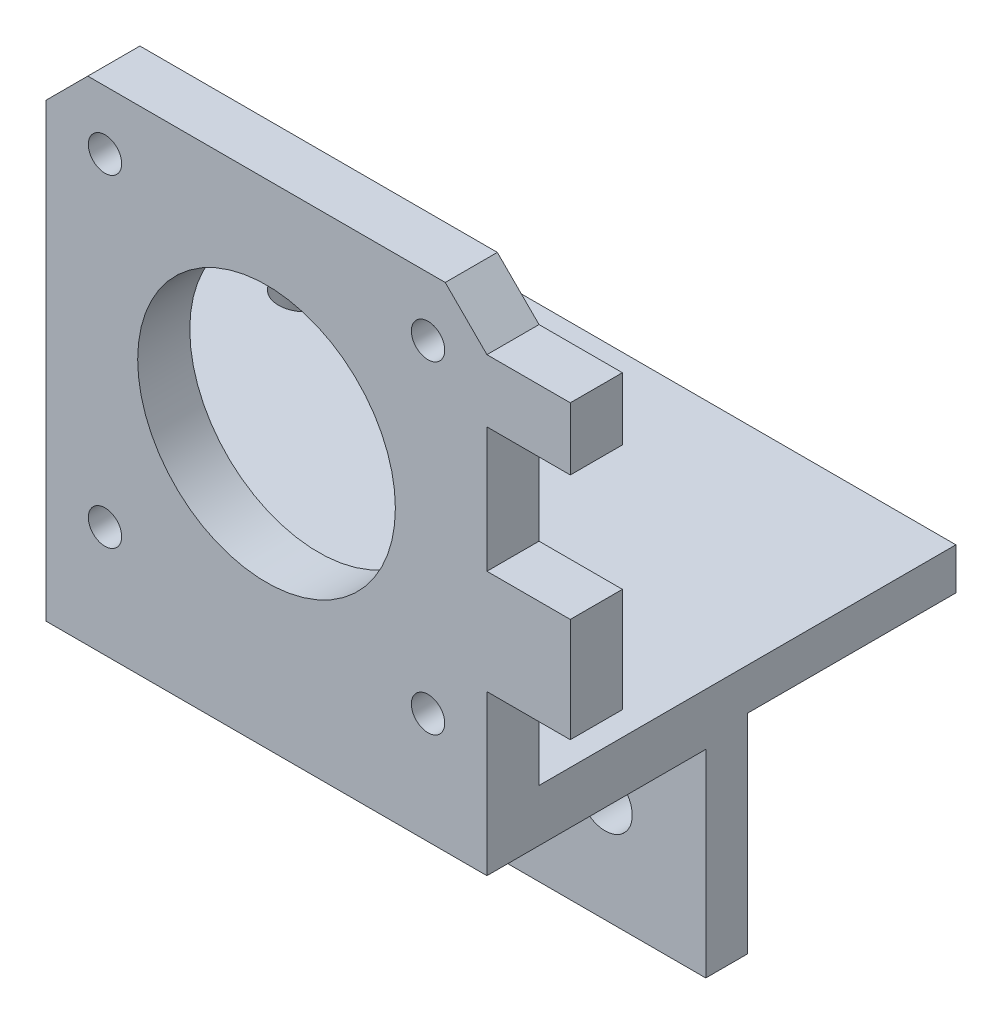
ISO-10303-21;
HEADER;
FILE_DESCRIPTION(('STEP AP214'),'2;1');
FILE_NAME('part.step','',(''),(''),'','','');
FILE_SCHEMA(('AUTOMOTIVE_DESIGN { 1 0 10303 214 1 1 1 1 }'));
ENDSEC;
DATA;
#1=APPLICATION_CONTEXT('core data for automotive mechanical design processes');
#2=APPLICATION_PROTOCOL_DEFINITION('international standard','automotive_design',2000,#1);
#3=PRODUCT_CONTEXT('',#1,'mechanical');
#4=PRODUCT('Part','Part','',(#3));
#5=PRODUCT_RELATED_PRODUCT_CATEGORY('part','',(#4));
#6=PRODUCT_DEFINITION_FORMATION('','',#4);
#7=PRODUCT_DEFINITION_CONTEXT('part definition',#1,'design');
#8=PRODUCT_DEFINITION('design','',#6,#7);
#9=PRODUCT_DEFINITION_SHAPE('','',#8);
#10=(LENGTH_UNIT() NAMED_UNIT(*) SI_UNIT(.MILLI.,.METRE.));
#11=(NAMED_UNIT(*) PLANE_ANGLE_UNIT() SI_UNIT($,.RADIAN.));
#12=(NAMED_UNIT(*) SI_UNIT($,.STERADIAN.) SOLID_ANGLE_UNIT());
#13=UNCERTAINTY_MEASURE_WITH_UNIT(LENGTH_MEASURE(1.E-05),#10,'distance_accuracy_value','');
#14=(GEOMETRIC_REPRESENTATION_CONTEXT(3) GLOBAL_UNCERTAINTY_ASSIGNED_CONTEXT((#13)) GLOBAL_UNIT_ASSIGNED_CONTEXT((#10,
#11,#12)) REPRESENTATION_CONTEXT('',''));
#15=CARTESIAN_POINT('',(0.,0.,0.));
#16=DIRECTION('',(0.,0.,1.));
#17=DIRECTION('',(1.,0.,0.));
#18=AXIS2_PLACEMENT_3D('',#15,#16,#17);
#19=CARTESIAN_POINT('',(-40.,-12.9710597708542,4.));
#20=DIRECTION('',(-1.,0.,0.));
#21=DIRECTION('',(0.,0.,1.));
#22=AXIS2_PLACEMENT_3D('',#19,#20,#21);
#23=PLANE('',#22);
#24=DIRECTION('',(0.,0.,-1.));
#25=VECTOR('',#24,1.);
#26=CARTESIAN_POINT('',(-40.,21.3289402291457,25.));
#27=LINE('',#26,#25);
#28=CARTESIAN_POINT('',(-40.,21.3289402291457,25.));
#29=VERTEX_POINT('',#28);
#30=CARTESIAN_POINT('',(-40.,21.3289402291457,20.));
#31=VERTEX_POINT('',#30);
#32=EDGE_CURVE('E769',#29,#31,#27,.T.);
#33=ORIENTED_EDGE('',*,*,#32,.F.);
#34=DIRECTION('',(0.,1.,0.));
#35=VECTOR('',#34,1.);
#36=CARTESIAN_POINT('',(-40.,6.02894022914577,25.));
#37=LINE('',#36,#35);
#38=CARTESIAN_POINT('',(-40.,6.02894022914577,25.));
#39=VERTEX_POINT('',#38);
#40=EDGE_CURVE('E194',#39,#29,#37,.T.);
#41=ORIENTED_EDGE('',*,*,#40,.F.);
#42=DIRECTION('',(0.,0.,-1.));
#43=VECTOR('',#42,1.);
#44=CARTESIAN_POINT('',(-40.,6.02894022914577,62.5944832108573));
#45=LINE('',#44,#43);
#46=CARTESIAN_POINT('',(-40.,6.02894022914576,4.));
#47=VERTEX_POINT('',#46);
#48=EDGE_CURVE('E336',#39,#47,#45,.T.);
#49=ORIENTED_EDGE('',*,*,#48,.T.);
#50=DIRECTION('',(0.,1.,0.));
#51=VECTOR('',#50,1.);
#52=CARTESIAN_POINT('',(-40.,-12.9710597708542,4.));
#53=LINE('',#52,#51);
#54=CARTESIAN_POINT('',(-40.,-12.9710597708542,4.));
#55=VERTEX_POINT('',#54);
#56=EDGE_CURVE('E349',#55,#47,#53,.T.);
#57=ORIENTED_EDGE('',*,*,#56,.F.);
#58=DIRECTION('',(0.,0.,-1.));
#59=VECTOR('',#58,1.);
#60=CARTESIAN_POINT('',(-40.,-12.9710597708542,4.));
#61=LINE('',#60,#59);
#62=CARTESIAN_POINT('',(-40.,-12.9710597708542,0.));
#63=VERTEX_POINT('',#62);
#64=EDGE_CURVE('E358',#55,#63,#61,.T.);
#65=ORIENTED_EDGE('',*,*,#64,.T.);
#66=DIRECTION('',(0.,1.,0.));
#67=VECTOR('',#66,1.);
#68=CARTESIAN_POINT('',(-40.,-12.9710597708542,0.));
#69=LINE('',#68,#67);
#70=CARTESIAN_POINT('',(-40.,7.02894022914576,0.));
#71=VERTEX_POINT('',#70);
#72=EDGE_CURVE('E344',#63,#71,#69,.T.);
#73=ORIENTED_EDGE('',*,*,#72,.T.);
#74=DIRECTION('',(0.,0.,1.));
#75=VECTOR('',#74,1.);
#76=CARTESIAN_POINT('',(-40.,7.02894022914576,-82.5196876527666));
#77=LINE('',#76,#75);
#78=CARTESIAN_POINT('',(-40.,7.02894022914576,-20.));
#79=VERTEX_POINT('',#78);
#80=EDGE_CURVE('E247',#79,#71,#77,.T.);
#81=ORIENTED_EDGE('',*,*,#80,.F.);
#82=DIRECTION('',(0.,1.,0.));
#83=VECTOR('',#82,1.);
#84=CARTESIAN_POINT('',(-40.,11.0289402291458,-20.));
#85=LINE('',#84,#83);
#86=CARTESIAN_POINT('',(-40.,11.0289402291458,-20.));
#87=VERTEX_POINT('',#86);
#88=EDGE_CURVE('E238',#79,#87,#85,.T.);
#89=ORIENTED_EDGE('',*,*,#88,.T.);
#90=DIRECTION('',(0.,0.,-1.));
#91=VECTOR('',#90,1.);
#92=CARTESIAN_POINT('',(-40.,11.0289402291458,4.));
#93=LINE('',#92,#91);
#94=CARTESIAN_POINT('',(-40.,11.0289402291458,20.));
#95=VERTEX_POINT('',#94);
#96=EDGE_CURVE('E371',#95,#87,#93,.T.);
#97=ORIENTED_EDGE('',*,*,#96,.F.);
#98=DIRECTION('',(0.,1.,0.));
#99=VECTOR('',#98,1.);
#100=CARTESIAN_POINT('',(-40.,6.02894022914577,20.));
#101=LINE('',#100,#99);
#102=EDGE_CURVE('E313',#95,#31,#101,.T.);
#103=ORIENTED_EDGE('',*,*,#102,.T.);
#104=EDGE_LOOP('',(#33,#41,#49,#57,#65,#73,#81,#89,#97,#103));
#105=FACE_BOUND('',#104,.T.);
#106=ADVANCED_FACE('F32',(#105),#23,.F.);
#107=DIRECTION('',(0.,0.,1.));
#108=VECTOR('',#107,1.);
#109=CARTESIAN_POINT('',(-40.,31.3289402291457,25.));
#110=LINE('',#109,#108);
#111=CARTESIAN_POINT('',(-40.,31.3289402291457,20.));
#112=VERTEX_POINT('',#111);
#113=CARTESIAN_POINT('',(-40.,31.3289402291457,25.));
#114=VERTEX_POINT('',#113);
#115=EDGE_CURVE('E187',#112,#114,#110,.T.);
#116=ORIENTED_EDGE('',*,*,#115,.F.);
#117=CARTESIAN_POINT('',(-40.,43.3289402291457,20.));
#118=VERTEX_POINT('',#117);
#119=EDGE_CURVE('E297',#112,#118,#101,.T.);
#120=ORIENTED_EDGE('',*,*,#119,.T.);
#121=DIRECTION('',(0.,0.,-1.));
#122=VECTOR('',#121,1.);
#123=CARTESIAN_POINT('',(-40.,43.3289402291457,25.));
#124=LINE('',#123,#122);
#125=CARTESIAN_POINT('',(-40.0000000000001,43.3289402291457,25.));
#126=VERTEX_POINT('',#125);
#127=EDGE_CURVE('E195',#126,#118,#124,.T.);
#128=ORIENTED_EDGE('',*,*,#127,.F.);
#129=EDGE_CURVE('E52',#114,#126,#37,.T.);
#130=ORIENTED_EDGE('',*,*,#129,.F.);
#131=EDGE_LOOP('',(#116,#120,#128,#130));
#132=FACE_BOUND('',#131,.T.);
#133=ADVANCED_FACE('F426',(#132),#23,.F.);
#134=CARTESIAN_POINT('',(0.,0.,0.));
#135=DIRECTION('',(0.,0.,1.));
#136=DIRECTION('',(1.,0.,0.));
#137=AXIS2_PLACEMENT_3D('',#134,#135,#136);
#138=PLANE('',#137);
#139=CARTESIAN_POINT('',(-49.6556066891385,-2.97105977085421,0.));
#140=DIRECTION('',(0.,0.,1.));
#141=DIRECTION('',(1.,0.,0.));
#142=AXIS2_PLACEMENT_3D('',#139,#140,#141);
#143=CIRCLE('',#142,2.6);
#144=CARTESIAN_POINT('',(-47.0556066891385,-2.97105977085421,0.));
#145=VERTEX_POINT('',#144);
#146=EDGE_CURVE('E265',#145,#145,#143,.T.);
#147=ORIENTED_EDGE('',*,*,#146,.T.);
#148=EDGE_LOOP('',(#147));
#149=FACE_BOUND('',#148,.T.);
#150=CARTESIAN_POINT('',(-69.6556066891385,-2.97105977085421,0.));
#151=DIRECTION('',(0.,0.,1.));
#152=DIRECTION('',(1.,0.,0.));
#153=AXIS2_PLACEMENT_3D('',#150,#151,#152);
#154=CIRCLE('',#153,2.6);
#155=CARTESIAN_POINT('',(-67.0556066891385,-2.97105977085421,0.));
#156=VERTEX_POINT('',#155);
#157=EDGE_CURVE('E259',#156,#156,#154,.T.);
#158=ORIENTED_EDGE('',*,*,#157,.T.);
#159=EDGE_LOOP('',(#158));
#160=FACE_BOUND('',#159,.T.);
#161=CARTESIAN_POINT('',(-89.6556066891385,-2.97105977085421,0.));
#162=DIRECTION('',(0.,0.,1.));
#163=DIRECTION('',(1.,0.,0.));
#164=AXIS2_PLACEMENT_3D('',#161,#162,#163);
#165=CIRCLE('',#164,2.6);
#166=CARTESIAN_POINT('',(-87.0556066891385,-2.97105977085421,0.));
#167=VERTEX_POINT('',#166);
#168=EDGE_CURVE('E252',#167,#167,#165,.T.);
#169=ORIENTED_EDGE('',*,*,#168,.T.);
#170=EDGE_LOOP('',(#169));
#171=FACE_BOUND('',#170,.T.);
#172=DIRECTION('',(-1.,0.,0.));
#173=VECTOR('',#172,1.);
#174=CARTESIAN_POINT('',(-40.,7.02894022914576,0.));
#175=LINE('',#174,#173);
#176=CARTESIAN_POINT('',(-102.391596743468,7.02894022914576,0.));
#177=VERTEX_POINT('',#176);
#178=EDGE_CURVE('E228',#71,#177,#175,.T.);
#179=ORIENTED_EDGE('',*,*,#178,.F.);
#180=ORIENTED_EDGE('',*,*,#72,.F.);
#181=DIRECTION('',(1.,0.,0.));
#182=VECTOR('',#181,1.);
#183=CARTESIAN_POINT('',(-40.,-12.9710597708542,0.));
#184=LINE('',#183,#182);
#185=CARTESIAN_POINT('',(-102.391596743468,-12.9710597708542,0.));
#186=VERTEX_POINT('',#185);
#187=EDGE_CURVE('E352',#186,#63,#184,.T.);
#188=ORIENTED_EDGE('',*,*,#187,.F.);
#189=DIRECTION('',(0.,-1.,0.));
#190=VECTOR('',#189,1.);
#191=CARTESIAN_POINT('',(-102.391596743468,-12.9710597708542,0.));
#192=LINE('',#191,#190);
#193=EDGE_CURVE('E361',#177,#186,#192,.T.);
#194=ORIENTED_EDGE('',*,*,#193,.F.);
#195=EDGE_LOOP('',(#179,#180,#188,#194));
#196=FACE_BOUND('',#195,.T.);
#197=ADVANCED_FACE('F424',(#149,#160,#171,#196),#138,.F.);
#198=CARTESIAN_POINT('',(-40.,11.0289402291458,4.));
#199=DIRECTION('',(0.,-1.,0.));
#200=DIRECTION('',(0.,0.,-1.));
#201=AXIS2_PLACEMENT_3D('',#198,#199,#200);
#202=PLANE('',#201);
#203=CARTESIAN_POINT('',(-92.3915967434677,11.0289402291458,-10.));
#204=DIRECTION('',(0.,1.,0.));
#205=DIRECTION('',(0.,0.,1.));
#206=AXIS2_PLACEMENT_3D('',#203,#204,#205);
#207=CIRCLE('',#206,2.6);
#208=CARTESIAN_POINT('',(-92.3915967434677,11.0289402291458,-7.4));
#209=VERTEX_POINT('',#208);
#210=EDGE_CURVE('E224',#209,#209,#207,.T.);
#211=ORIENTED_EDGE('',*,*,#210,.F.);
#212=EDGE_LOOP('',(#211));
#213=FACE_BOUND('',#212,.T.);
#214=ORIENTED_EDGE('',*,*,#96,.T.);
#215=DIRECTION('',(-1.,0.,0.));
#216=VECTOR('',#215,1.);
#217=CARTESIAN_POINT('',(-40.,11.0289402291458,-20.));
#218=LINE('',#217,#216);
#219=CARTESIAN_POINT('',(-102.391596743468,11.0289402291458,-20.));
#220=VERTEX_POINT('',#219);
#221=EDGE_CURVE('E235',#87,#220,#218,.T.);
#222=ORIENTED_EDGE('',*,*,#221,.T.);
#223=DIRECTION('',(0.,0.,-1.));
#224=VECTOR('',#223,1.);
#225=CARTESIAN_POINT('',(-102.391596743468,11.0289402291458,4.));
#226=LINE('',#225,#224);
#227=CARTESIAN_POINT('',(-102.391596743468,11.0289402291458,4.));
#228=VERTEX_POINT('',#227);
#229=EDGE_CURVE('E369',#228,#220,#226,.T.);
#230=ORIENTED_EDGE('',*,*,#229,.F.);
#231=DIRECTION('',(-1.,0.,0.));
#232=VECTOR('',#231,1.);
#233=CARTESIAN_POINT('',(-40.,11.0289402291458,4.));
#234=LINE('',#233,#232);
#235=CARTESIAN_POINT('',(-98.3,11.0289402291458,4.));
#236=VERTEX_POINT('',#235);
#237=EDGE_CURVE('E351',#236,#228,#234,.T.);
#238=ORIENTED_EDGE('',*,*,#237,.F.);
#239=DIRECTION('',(0.707106781186544,0.,0.707106781186551));
#240=VECTOR('',#239,1.);
#241=CARTESIAN_POINT('',(-69.1500000000003,11.0289402291458,33.15));
#242=LINE('',#241,#240);
#243=CARTESIAN_POINT('',(-82.3,11.0289402291458,20.));
#244=VERTEX_POINT('',#243);
#245=EDGE_CURVE('E11',#236,#244,#242,.T.);
#246=ORIENTED_EDGE('',*,*,#245,.T.);
#247=DIRECTION('',(-1.,0.,0.));
#248=VECTOR('',#247,1.);
#249=CARTESIAN_POINT('',(-40.,11.0289402291458,20.));
#250=LINE('',#249,#248);
#251=EDGE_CURVE('E340',#95,#244,#250,.T.);
#252=ORIENTED_EDGE('',*,*,#251,.F.);
#253=EDGE_LOOP('',(#214,#222,#230,#238,#246,#252));
#254=FACE_BOUND('',#253,.T.);
#255=ADVANCED_FACE('F390',(#213,#254),#202,.F.);
#256=CARTESIAN_POINT('',(-102.391596743468,-12.9710597708542,4.));
#257=DIRECTION('',(1.,0.,0.));
#258=DIRECTION('',(0.,0.,-1.));
#259=AXIS2_PLACEMENT_3D('',#256,#257,#258);
#260=PLANE('',#259);
#261=ORIENTED_EDGE('',*,*,#229,.T.);
#262=DIRECTION('',(0.,-1.,0.));
#263=VECTOR('',#262,1.);
#264=CARTESIAN_POINT('',(-102.391596743468,11.0289402291458,-20.));
#265=LINE('',#264,#263);
#266=CARTESIAN_POINT('',(-102.391596743468,7.02894022914576,-20.));
#267=VERTEX_POINT('',#266);
#268=EDGE_CURVE('E231',#220,#267,#265,.T.);
#269=ORIENTED_EDGE('',*,*,#268,.T.);
#270=DIRECTION('',(0.,0.,1.));
#271=VECTOR('',#270,1.);
#272=CARTESIAN_POINT('',(-102.391596743468,7.02894022914576,-82.5196876527666));
#273=LINE('',#272,#271);
#274=EDGE_CURVE('E244',#267,#177,#273,.T.);
#275=ORIENTED_EDGE('',*,*,#274,.T.);
#276=ORIENTED_EDGE('',*,*,#193,.T.);
#277=DIRECTION('',(0.,0.,-1.));
#278=VECTOR('',#277,1.);
#279=CARTESIAN_POINT('',(-102.391596743468,-12.9710597708542,4.));
#280=LINE('',#279,#278);
#281=CARTESIAN_POINT('',(-102.391596743468,-12.9710597708542,4.));
#282=VERTEX_POINT('',#281);
#283=EDGE_CURVE('E366',#282,#186,#280,.T.);
#284=ORIENTED_EDGE('',*,*,#283,.F.);
#285=DIRECTION('',(0.,-1.,0.));
#286=VECTOR('',#285,1.);
#287=CARTESIAN_POINT('',(-102.391596743468,-12.9710597708542,4.));
#288=LINE('',#287,#286);
#289=EDGE_CURVE('E354',#228,#282,#288,.T.);
#290=ORIENTED_EDGE('',*,*,#289,.F.);
#291=EDGE_LOOP('',(#261,#269,#275,#276,#284,#290));
#292=FACE_BOUND('',#291,.T.);
#293=ADVANCED_FACE('F397',(#292),#260,.F.);
#294=CARTESIAN_POINT('',(-40.,-12.9710597708542,4.));
#295=DIRECTION('',(0.,1.,0.));
#296=DIRECTION('',(0.,0.,1.));
#297=AXIS2_PLACEMENT_3D('',#294,#295,#296);
#298=PLANE('',#297);
#299=ORIENTED_EDGE('',*,*,#187,.T.);
#300=ORIENTED_EDGE('',*,*,#64,.F.);
#301=DIRECTION('',(1.,0.,0.));
#302=VECTOR('',#301,1.);
#303=CARTESIAN_POINT('',(-40.,-12.9710597708542,4.));
#304=LINE('',#303,#302);
#305=EDGE_CURVE('E356',#282,#55,#304,.T.);
#306=ORIENTED_EDGE('',*,*,#305,.F.);
#307=ORIENTED_EDGE('',*,*,#283,.T.);
#308=EDGE_LOOP('',(#299,#300,#306,#307));
#309=FACE_BOUND('',#308,.T.);
#310=ADVANCED_FACE('F402',(#309),#298,.F.);
#311=CARTESIAN_POINT('',(0.,0.,4.));
#312=DIRECTION('',(0.,0.,1.));
#313=DIRECTION('',(1.,0.,0.));
#314=AXIS2_PLACEMENT_3D('',#311,#312,#313);
#315=PLANE('',#314);
#316=CARTESIAN_POINT('',(-89.6556066891385,-2.97105977085421,4.));
#317=DIRECTION('',(0.,0.,1.));
#318=DIRECTION('',(1.,0.,0.));
#319=AXIS2_PLACEMENT_3D('',#316,#317,#318);
#320=CIRCLE('',#319,2.6);
#321=CARTESIAN_POINT('',(-87.0556066891385,-2.97105977085421,4.));
#322=VERTEX_POINT('',#321);
#323=EDGE_CURVE('E256',#322,#322,#320,.T.);
#324=ORIENTED_EDGE('',*,*,#323,.F.);
#325=EDGE_LOOP('',(#324));
#326=FACE_BOUND('',#325,.T.);
#327=CARTESIAN_POINT('',(-69.6556066891385,-2.97105977085421,4.));
#328=DIRECTION('',(0.,0.,1.));
#329=DIRECTION('',(1.,0.,0.));
#330=AXIS2_PLACEMENT_3D('',#327,#328,#329);
#331=CIRCLE('',#330,2.6);
#332=CARTESIAN_POINT('',(-67.0556066891385,-2.97105977085421,4.));
#333=VERTEX_POINT('',#332);
#334=EDGE_CURVE('E262',#333,#333,#331,.T.);
#335=ORIENTED_EDGE('',*,*,#334,.F.);
#336=EDGE_LOOP('',(#335));
#337=FACE_BOUND('',#336,.T.);
#338=CARTESIAN_POINT('',(-49.6556066891385,-2.97105977085421,4.));
#339=DIRECTION('',(0.,0.,1.));
#340=DIRECTION('',(1.,0.,0.));
#341=AXIS2_PLACEMENT_3D('',#338,#339,#340);
#342=CIRCLE('',#341,2.6);
#343=CARTESIAN_POINT('',(-47.0556066891385,-2.97105977085421,4.));
#344=VERTEX_POINT('',#343);
#345=EDGE_CURVE('E241',#344,#344,#342,.T.);
#346=ORIENTED_EDGE('',*,*,#345,.F.);
#347=EDGE_LOOP('',(#346));
#348=FACE_BOUND('',#347,.T.);
#349=DIRECTION('',(1.,0.,0.));
#350=VECTOR('',#349,1.);
#351=CARTESIAN_POINT('',(-40.,6.02894022914577,4.));
#352=LINE('',#351,#350);
#353=CARTESIAN_POINT('',(-98.3,6.02894022914577,4.));
#354=VERTEX_POINT('',#353);
#355=EDGE_CURVE('E337',#354,#47,#352,.T.);
#356=ORIENTED_EDGE('',*,*,#355,.F.);
#357=DIRECTION('',(0.,1.,0.));
#358=VECTOR('',#357,1.);
#359=CARTESIAN_POINT('',(-98.3,0.,4.));
#360=LINE('',#359,#358);
#361=EDGE_CURVE('E376',#354,#236,#360,.T.);
#362=ORIENTED_EDGE('',*,*,#361,.T.);
#363=ORIENTED_EDGE('',*,*,#237,.T.);
#364=ORIENTED_EDGE('',*,*,#289,.T.);
#365=ORIENTED_EDGE('',*,*,#305,.T.);
#366=ORIENTED_EDGE('',*,*,#56,.T.);
#367=EDGE_LOOP('',(#356,#362,#363,#364,#365,#366));
#368=FACE_BOUND('',#367,.T.);
#369=ADVANCED_FACE('F387',(#326,#337,#348,#368),#315,.T.);
#370=CARTESIAN_POINT('',(-82.3,11.0289402291458,62.5944832108573));
#371=DIRECTION('',(1.,0.,0.));
#372=DIRECTION('',(0.,0.,-1.));
#373=AXIS2_PLACEMENT_3D('',#370,#371,#372);
#374=PLANE('',#373);
#375=DIRECTION('',(0.,-1.,0.));
#376=VECTOR('',#375,1.);
#377=CARTESIAN_POINT('',(-82.3,6.02894022914577,20.));
#378=LINE('',#377,#376);
#379=CARTESIAN_POINT('',(-82.3,49.3289402291458,20.));
#380=VERTEX_POINT('',#379);
#381=EDGE_CURVE('E322',#380,#244,#378,.T.);
#382=ORIENTED_EDGE('',*,*,#381,.T.);
#383=DIRECTION('',(0.,-1.,0.));
#384=VECTOR('',#383,1.);
#385=CARTESIAN_POINT('',(-82.3,11.0289402291458,20.0000000000001));
#386=LINE('',#385,#384);
#387=CARTESIAN_POINT('',(-82.3,6.02894022914577,20.0000000000001));
#388=VERTEX_POINT('',#387);
#389=EDGE_CURVE('E373',#244,#388,#386,.T.);
#390=ORIENTED_EDGE('',*,*,#389,.T.);
#391=DIRECTION('',(0.,0.,-1.));
#392=VECTOR('',#391,1.);
#393=CARTESIAN_POINT('',(-82.3,6.02894022914577,62.5944832108573));
#394=LINE('',#393,#392);
#395=CARTESIAN_POINT('',(-82.3,6.02894022914577,25.));
#396=VERTEX_POINT('',#395);
#397=EDGE_CURVE('E341',#396,#388,#394,.T.);
#398=ORIENTED_EDGE('',*,*,#397,.F.);
#399=DIRECTION('',(0.,-1.,0.));
#400=VECTOR('',#399,1.);
#401=CARTESIAN_POINT('',(-82.3,6.02894022914577,25.));
#402=LINE('',#401,#400);
#403=CARTESIAN_POINT('',(-82.3,49.3289402291458,25.));
#404=VERTEX_POINT('',#403);
#405=EDGE_CURVE('E307',#404,#396,#402,.T.);
#406=ORIENTED_EDGE('',*,*,#405,.F.);
#407=DIRECTION('',(0.,0.,-1.));
#408=VECTOR('',#407,1.);
#409=CARTESIAN_POINT('',(-82.3,49.3289402291458,25.));
#410=LINE('',#409,#408);
#411=EDGE_CURVE('E312',#404,#380,#410,.T.);
#412=ORIENTED_EDGE('',*,*,#411,.T.);
#413=EDGE_LOOP('',(#382,#390,#398,#406,#412));
#414=FACE_BOUND('',#413,.T.);
#415=ADVANCED_FACE('F410',(#414),#374,.F.);
#416=CARTESIAN_POINT('',(-40.,6.02894022914577,62.5944832108573));
#417=DIRECTION('',(0.,1.,0.));
#418=DIRECTION('',(-1.,0.,0.));
#419=AXIS2_PLACEMENT_3D('',#416,#417,#418);
#420=PLANE('',#419);
#421=ORIENTED_EDGE('',*,*,#48,.F.);
#422=DIRECTION('',(1.,0.,0.));
#423=VECTOR('',#422,1.);
#424=CARTESIAN_POINT('',(-40.,6.02894022914577,25.));
#425=LINE('',#424,#423);
#426=EDGE_CURVE('E310',#396,#39,#425,.T.);
#427=ORIENTED_EDGE('',*,*,#426,.F.);
#428=ORIENTED_EDGE('',*,*,#397,.T.);
#429=DIRECTION('',(-0.707106781186544,0.,-0.707106781186551));
#430=VECTOR('',#429,1.);
#431=CARTESIAN_POINT('',(-39.8527583945717,6.02894022914577,62.4472416054289));
#432=LINE('',#431,#430);
#433=EDGE_CURVE('E40',#388,#354,#432,.T.);
#434=ORIENTED_EDGE('',*,*,#433,.T.);
#435=ORIENTED_EDGE('',*,*,#355,.T.);
#436=EDGE_LOOP('',(#421,#427,#428,#434,#435));
#437=FACE_BOUND('',#436,.T.);
#438=ADVANCED_FACE('F380',(#437),#420,.F.);
#439=CARTESIAN_POINT('',(0.,0.,20.));
#440=DIRECTION('',(0.,0.,1.));
#441=DIRECTION('',(1.,0.,0.));
#442=AXIS2_PLACEMENT_3D('',#439,#440,#441);
#443=PLANE('',#442);
#444=CARTESIAN_POINT('',(-45.65,47.6789402291458,20.));
#445=DIRECTION('',(0.,0.,1.));
#446=DIRECTION('',(1.,0.,0.));
#447=AXIS2_PLACEMENT_3D('',#444,#445,#446);
#448=CIRCLE('',#447,1.6);
#449=CARTESIAN_POINT('',(-44.05,47.6789402291458,20.));
#450=VERTEX_POINT('',#449);
#451=EDGE_CURVE('E291',#450,#450,#448,.T.);
#452=ORIENTED_EDGE('',*,*,#451,.T.);
#453=EDGE_LOOP('',(#452));
#454=FACE_BOUND('',#453,.T.);
#455=CARTESIAN_POINT('',(-61.15,32.1789402291458,20.));
#456=DIRECTION('',(0.,0.,1.));
#457=DIRECTION('',(1.,0.,0.));
#458=AXIS2_PLACEMENT_3D('',#455,#456,#457);
#459=CIRCLE('',#458,12.3643409800213);
#460=CARTESIAN_POINT('',(-48.7856590199787,32.1789402291458,20.));
#461=VERTEX_POINT('',#460);
#462=EDGE_CURVE('E285',#461,#461,#459,.T.);
#463=ORIENTED_EDGE('',*,*,#462,.T.);
#464=EDGE_LOOP('',(#463));
#465=FACE_BOUND('',#464,.T.);
#466=CARTESIAN_POINT('',(-76.65,47.6789402291456,20.));
#467=DIRECTION('',(0.,0.,1.));
#468=DIRECTION('',(1.,0.,0.));
#469=AXIS2_PLACEMENT_3D('',#466,#467,#468);
#470=CIRCLE('',#469,1.6);
#471=CARTESIAN_POINT('',(-75.05,47.6789402291456,20.));
#472=VERTEX_POINT('',#471);
#473=EDGE_CURVE('E279',#472,#472,#470,.T.);
#474=ORIENTED_EDGE('',*,*,#473,.T.);
#475=EDGE_LOOP('',(#474));
#476=FACE_BOUND('',#475,.T.);
#477=CARTESIAN_POINT('',(-76.6499999999997,16.6789402291456,20.));
#478=DIRECTION('',(0.,0.,1.));
#479=DIRECTION('',(1.,0.,0.));
#480=AXIS2_PLACEMENT_3D('',#477,#478,#479);
#481=CIRCLE('',#480,1.6);
#482=CARTESIAN_POINT('',(-75.0499999999997,16.6789402291456,20.));
#483=VERTEX_POINT('',#482);
#484=EDGE_CURVE('E273',#483,#483,#481,.T.);
#485=ORIENTED_EDGE('',*,*,#484,.T.);
#486=EDGE_LOOP('',(#485));
#487=FACE_BOUND('',#486,.T.);
#488=CARTESIAN_POINT('',(-45.6499999999997,16.6789402291458,20.));
#489=DIRECTION('',(0.,0.,1.));
#490=DIRECTION('',(1.,0.,0.));
#491=AXIS2_PLACEMENT_3D('',#488,#489,#490);
#492=CIRCLE('',#491,1.6);
#493=CARTESIAN_POINT('',(-44.0499999999997,16.6789402291458,20.));
#494=VERTEX_POINT('',#493);
#495=EDGE_CURVE('E255',#494,#494,#492,.T.);
#496=ORIENTED_EDGE('',*,*,#495,.T.);
#497=EDGE_LOOP('',(#496));
#498=FACE_BOUND('',#497,.T.);
#499=ORIENTED_EDGE('',*,*,#102,.F.);
#500=ORIENTED_EDGE('',*,*,#251,.T.);
#501=ORIENTED_EDGE('',*,*,#381,.F.);
#502=DIRECTION('',(-0.707106781186547,-0.707106781186547,0.));
#503=VECTOR('',#502,1.);
#504=CARTESIAN_POINT('',(-78.3000000000001,53.3289402291457,20.));
#505=LINE('',#504,#503);
#506=CARTESIAN_POINT('',(-78.3000000000001,53.3289402291457,20.));
#507=VERTEX_POINT('',#506);
#508=EDGE_CURVE('E320',#507,#380,#505,.T.);
#509=ORIENTED_EDGE('',*,*,#508,.F.);
#510=DIRECTION('',(-1.,0.,0.));
#511=VECTOR('',#510,1.);
#512=CARTESIAN_POINT('',(-44.,53.3289402291458,20.));
#513=LINE('',#512,#511);
#514=CARTESIAN_POINT('',(-44.,53.3289402291458,20.));
#515=VERTEX_POINT('',#514);
#516=EDGE_CURVE('E318',#515,#507,#513,.T.);
#517=ORIENTED_EDGE('',*,*,#516,.F.);
#518=DIRECTION('',(-0.707106781186548,0.707106781186547,0.));
#519=VECTOR('',#518,1.);
#520=CARTESIAN_POINT('',(-40.0000000000001,49.3289402291458,20.));
#521=LINE('',#520,#519);
#522=CARTESIAN_POINT('',(-40.0000000000001,49.3289402291458,20.));
#523=VERTEX_POINT('',#522);
#524=EDGE_CURVE('E316',#523,#515,#521,.T.);
#525=ORIENTED_EDGE('',*,*,#524,.F.);
#526=DIRECTION('',(-1.,0.,0.));
#527=VECTOR('',#526,1.);
#528=CARTESIAN_POINT('',(-32.,49.3289402291458,20.));
#529=LINE('',#528,#527);
#530=CARTESIAN_POINT('',(-32.,49.3289402291458,20.));
#531=VERTEX_POINT('',#530);
#532=EDGE_CURVE('E215',#531,#523,#529,.T.);
#533=ORIENTED_EDGE('',*,*,#532,.F.);
#534=DIRECTION('',(0.,1.,0.));
#535=VECTOR('',#534,1.);
#536=CARTESIAN_POINT('',(-32.,49.3289402291458,20.));
#537=LINE('',#536,#535);
#538=CARTESIAN_POINT('',(-32.,43.3289402291457,20.));
#539=VERTEX_POINT('',#538);
#540=EDGE_CURVE('E208',#539,#531,#537,.T.);
#541=ORIENTED_EDGE('',*,*,#540,.F.);
#542=DIRECTION('',(-1.,0.,0.));
#543=VECTOR('',#542,1.);
#544=CARTESIAN_POINT('',(-32.,43.3289402291457,20.));
#545=LINE('',#544,#543);
#546=EDGE_CURVE('E218',#539,#118,#545,.T.);
#547=ORIENTED_EDGE('',*,*,#546,.T.);
#548=ORIENTED_EDGE('',*,*,#119,.F.);
#549=DIRECTION('',(-1.,0.,0.));
#550=VECTOR('',#549,1.);
#551=CARTESIAN_POINT('',(-32.,31.3289402291457,20.));
#552=LINE('',#551,#550);
#553=CARTESIAN_POINT('',(-32.,31.3289402291457,20.));
#554=VERTEX_POINT('',#553);
#555=EDGE_CURVE('E200',#554,#112,#552,.T.);
#556=ORIENTED_EDGE('',*,*,#555,.F.);
#557=DIRECTION('',(0.,1.,0.));
#558=VECTOR('',#557,1.);
#559=CARTESIAN_POINT('',(-32.,31.3289402291457,20.));
#560=LINE('',#559,#558);
#561=CARTESIAN_POINT('',(-32.,21.3289402291457,20.));
#562=VERTEX_POINT('',#561);
#563=EDGE_CURVE('E181',#562,#554,#560,.T.);
#564=ORIENTED_EDGE('',*,*,#563,.F.);
#565=DIRECTION('',(-1.,0.,0.));
#566=VECTOR('',#565,1.);
#567=CARTESIAN_POINT('',(-32.,21.3289402291457,20.));
#568=LINE('',#567,#566);
#569=EDGE_CURVE('E178',#562,#31,#568,.T.);
#570=ORIENTED_EDGE('',*,*,#569,.T.);
#571=EDGE_LOOP('',(#499,#500,#501,#509,#517,#525,#533,#541,#547,#548,#556,#564,#570));
#572=FACE_BOUND('',#571,.T.);
#573=ADVANCED_FACE('F415',(#454,#465,#476,#487,#498,#572),#443,.F.);
#574=CARTESIAN_POINT('',(0.,0.,25.));
#575=DIRECTION('',(0.,0.,1.));
#576=DIRECTION('',(1.,0.,0.));
#577=AXIS2_PLACEMENT_3D('',#574,#575,#576);
#578=PLANE('',#577);
#579=CARTESIAN_POINT('',(-76.6499999999997,16.6789402291456,25.));
#580=DIRECTION('',(0.,0.,1.));
#581=DIRECTION('',(1.,0.,0.));
#582=AXIS2_PLACEMENT_3D('',#579,#580,#581);
#583=CIRCLE('',#582,1.6);
#584=CARTESIAN_POINT('',(-75.0499999999997,16.6789402291456,25.));
#585=VERTEX_POINT('',#584);
#586=EDGE_CURVE('E276',#585,#585,#583,.T.);
#587=ORIENTED_EDGE('',*,*,#586,.F.);
#588=EDGE_LOOP('',(#587));
#589=FACE_BOUND('',#588,.T.);
#590=CARTESIAN_POINT('',(-61.15,32.1789402291458,25.));
#591=DIRECTION('',(0.,0.,1.));
#592=DIRECTION('',(1.,0.,0.));
#593=AXIS2_PLACEMENT_3D('',#590,#591,#592);
#594=CIRCLE('',#593,12.3643409800213);
#595=CARTESIAN_POINT('',(-48.7856590199787,32.1789402291458,25.));
#596=VERTEX_POINT('',#595);
#597=EDGE_CURVE('E288',#596,#596,#594,.T.);
#598=ORIENTED_EDGE('',*,*,#597,.F.);
#599=EDGE_LOOP('',(#598));
#600=FACE_BOUND('',#599,.T.);
#601=ORIENTED_EDGE('',*,*,#40,.T.);
#602=DIRECTION('',(-1.,0.,0.));
#603=VECTOR('',#602,1.);
#604=CARTESIAN_POINT('',(-32.,21.3289402291457,25.));
#605=LINE('',#604,#603);
#606=CARTESIAN_POINT('',(-32.,21.3289402291457,25.));
#607=VERTEX_POINT('',#606);
#608=EDGE_CURVE('E175',#607,#29,#605,.T.);
#609=ORIENTED_EDGE('',*,*,#608,.F.);
#610=DIRECTION('',(0.,-1.,0.));
#611=VECTOR('',#610,1.);
#612=CARTESIAN_POINT('',(-32.,31.3289402291457,25.));
#613=LINE('',#612,#611);
#614=CARTESIAN_POINT('',(-32.,31.3289402291457,25.));
#615=VERTEX_POINT('',#614);
#616=EDGE_CURVE('E182',#615,#607,#613,.T.);
#617=ORIENTED_EDGE('',*,*,#616,.F.);
#618=DIRECTION('',(-1.,0.,0.));
#619=VECTOR('',#618,1.);
#620=CARTESIAN_POINT('',(-32.,31.3289402291457,25.));
#621=LINE('',#620,#619);
#622=EDGE_CURVE('E47',#615,#114,#621,.T.);
#623=ORIENTED_EDGE('',*,*,#622,.T.);
#624=ORIENTED_EDGE('',*,*,#129,.T.);
#625=DIRECTION('',(-1.,0.,0.));
#626=VECTOR('',#625,1.);
#627=CARTESIAN_POINT('',(-32.,43.3289402291457,25.));
#628=LINE('',#627,#626);
#629=CARTESIAN_POINT('',(-32.,43.3289402291457,25.));
#630=VERTEX_POINT('',#629);
#631=EDGE_CURVE('E221',#630,#126,#628,.T.);
#632=ORIENTED_EDGE('',*,*,#631,.F.);
#633=DIRECTION('',(0.,-1.,0.));
#634=VECTOR('',#633,1.);
#635=CARTESIAN_POINT('',(-32.,49.3289402291458,25.));
#636=LINE('',#635,#634);
#637=CARTESIAN_POINT('',(-32.,49.3289402291458,25.));
#638=VERTEX_POINT('',#637);
#639=EDGE_CURVE('E198',#638,#630,#636,.T.);
#640=ORIENTED_EDGE('',*,*,#639,.F.);
#641=DIRECTION('',(-1.,0.,0.));
#642=VECTOR('',#641,1.);
#643=CARTESIAN_POINT('',(-32.,49.3289402291458,25.));
#644=LINE('',#643,#642);
#645=CARTESIAN_POINT('',(-40.0000000000001,49.3289402291458,25.));
#646=VERTEX_POINT('',#645);
#647=EDGE_CURVE('E211',#638,#646,#644,.T.);
#648=ORIENTED_EDGE('',*,*,#647,.T.);
#649=DIRECTION('',(-0.707106781186548,0.707106781186547,0.));
#650=VECTOR('',#649,1.);
#651=CARTESIAN_POINT('',(-40.0000000000001,49.3289402291458,25.));
#652=LINE('',#651,#650);
#653=CARTESIAN_POINT('',(-44.,53.3289402291458,25.));
#654=VERTEX_POINT('',#653);
#655=EDGE_CURVE('E301',#646,#654,#652,.T.);
#656=ORIENTED_EDGE('',*,*,#655,.T.);
#657=DIRECTION('',(-1.,0.,0.));
#658=VECTOR('',#657,1.);
#659=CARTESIAN_POINT('',(-44.,53.3289402291458,25.));
#660=LINE('',#659,#658);
#661=CARTESIAN_POINT('',(-78.3000000000001,53.3289402291457,25.));
#662=VERTEX_POINT('',#661);
#663=EDGE_CURVE('E303',#654,#662,#660,.T.);
#664=ORIENTED_EDGE('',*,*,#663,.T.);
#665=DIRECTION('',(-0.707106781186547,-0.707106781186547,0.));
#666=VECTOR('',#665,1.);
#667=CARTESIAN_POINT('',(-78.3000000000001,53.3289402291457,25.));
#668=LINE('',#667,#666);
#669=EDGE_CURVE('E305',#662,#404,#668,.T.);
#670=ORIENTED_EDGE('',*,*,#669,.T.);
#671=ORIENTED_EDGE('',*,*,#405,.T.);
#672=ORIENTED_EDGE('',*,*,#426,.T.);
#673=EDGE_LOOP('',(#601,#609,#617,#623,#624,#632,#640,#648,#656,#664,#670,#671,#672));
#674=FACE_BOUND('',#673,.T.);
#675=CARTESIAN_POINT('',(-45.65,47.6789402291458,25.));
#676=DIRECTION('',(0.,0.,1.));
#677=DIRECTION('',(1.,0.,0.));
#678=AXIS2_PLACEMENT_3D('',#675,#676,#677);
#679=CIRCLE('',#678,1.6);
#680=CARTESIAN_POINT('',(-44.05,47.6789402291458,25.));
#681=VERTEX_POINT('',#680);
#682=EDGE_CURVE('E294',#681,#681,#679,.T.);
#683=ORIENTED_EDGE('',*,*,#682,.F.);
#684=EDGE_LOOP('',(#683));
#685=FACE_BOUND('',#684,.T.);
#686=CARTESIAN_POINT('',(-76.65,47.6789402291456,25.));
#687=DIRECTION('',(0.,0.,1.));
#688=DIRECTION('',(1.,0.,0.));
#689=AXIS2_PLACEMENT_3D('',#686,#687,#688);
#690=CIRCLE('',#689,1.6);
#691=CARTESIAN_POINT('',(-75.05,47.6789402291456,25.));
#692=VERTEX_POINT('',#691);
#693=EDGE_CURVE('E282',#692,#692,#690,.T.);
#694=ORIENTED_EDGE('',*,*,#693,.F.);
#695=EDGE_LOOP('',(#694));
#696=FACE_BOUND('',#695,.T.);
#697=CARTESIAN_POINT('',(-45.6499999999997,16.6789402291458,25.));
#698=DIRECTION('',(0.,0.,1.));
#699=DIRECTION('',(1.,0.,0.));
#700=AXIS2_PLACEMENT_3D('',#697,#698,#699);
#701=CIRCLE('',#700,1.6);
#702=CARTESIAN_POINT('',(-44.0499999999997,16.6789402291458,25.));
#703=VERTEX_POINT('',#702);
#704=EDGE_CURVE('E270',#703,#703,#701,.T.);
#705=ORIENTED_EDGE('',*,*,#704,.F.);
#706=EDGE_LOOP('',(#705));
#707=FACE_BOUND('',#706,.T.);
#708=ADVANCED_FACE('F190',(#589,#600,#674,#685,#696,#707),#578,.T.);
#709=CARTESIAN_POINT('',(-40.0000000000001,49.3289402291458,25.));
#710=DIRECTION('',(-0.707106781186547,-0.707106781186548,0.));
#711=DIRECTION('',(0.707106781186548,-0.707106781186547,0.));
#712=AXIS2_PLACEMENT_3D('',#709,#710,#711);
#713=PLANE('',#712);
#714=ORIENTED_EDGE('',*,*,#524,.T.);
#715=DIRECTION('',(0.,0.,-1.));
#716=VECTOR('',#715,1.);
#717=CARTESIAN_POINT('',(-44.,53.3289402291458,25.));
#718=LINE('',#717,#716);
#719=EDGE_CURVE('E330',#654,#515,#718,.T.);
#720=ORIENTED_EDGE('',*,*,#719,.F.);
#721=ORIENTED_EDGE('',*,*,#655,.F.);
#722=DIRECTION('',(0.,0.,-1.));
#723=VECTOR('',#722,1.);
#724=CARTESIAN_POINT('',(-40.0000000000001,49.3289402291458,25.));
#725=LINE('',#724,#723);
#726=EDGE_CURVE('E333',#646,#523,#725,.T.);
#727=ORIENTED_EDGE('',*,*,#726,.T.);
#728=EDGE_LOOP('',(#714,#720,#721,#727));
#729=FACE_BOUND('',#728,.T.);
#730=ADVANCED_FACE('F458',(#729),#713,.F.);
#731=CARTESIAN_POINT('',(-44.,53.3289402291458,25.));
#732=DIRECTION('',(0.,-1.,0.));
#733=DIRECTION('',(1.,0.,0.));
#734=AXIS2_PLACEMENT_3D('',#731,#732,#733);
#735=PLANE('',#734);
#736=ORIENTED_EDGE('',*,*,#516,.T.);
#737=DIRECTION('',(0.,0.,-1.));
#738=VECTOR('',#737,1.);
#739=CARTESIAN_POINT('',(-78.3000000000001,53.3289402291457,25.));
#740=LINE('',#739,#738);
#741=EDGE_CURVE('E327',#662,#507,#740,.T.);
#742=ORIENTED_EDGE('',*,*,#741,.F.);
#743=ORIENTED_EDGE('',*,*,#663,.F.);
#744=ORIENTED_EDGE('',*,*,#719,.T.);
#745=EDGE_LOOP('',(#736,#742,#743,#744));
#746=FACE_BOUND('',#745,.T.);
#747=ADVANCED_FACE('F461',(#746),#735,.F.);
#748=CARTESIAN_POINT('',(-78.3000000000001,53.3289402291457,25.));
#749=DIRECTION('',(0.707106781186548,-0.707106781186548,0.));
#750=DIRECTION('',(0.707106781186548,0.707106781186548,0.));
#751=AXIS2_PLACEMENT_3D('',#748,#749,#750);
#752=PLANE('',#751);
#753=ORIENTED_EDGE('',*,*,#508,.T.);
#754=ORIENTED_EDGE('',*,*,#411,.F.);
#755=ORIENTED_EDGE('',*,*,#669,.F.);
#756=ORIENTED_EDGE('',*,*,#741,.T.);
#757=EDGE_LOOP('',(#753,#754,#755,#756));
#758=FACE_BOUND('',#757,.T.);
#759=ADVANCED_FACE('F465',(#758),#752,.F.);
#760=CARTESIAN_POINT('',(-45.65,47.6789402291458,25.));
#761=DIRECTION('',(0.,0.,-1.));
#762=DIRECTION('',(-1.,0.,0.));
#763=AXIS2_PLACEMENT_3D('',#760,#761,#762);
#764=CYLINDRICAL_SURFACE('',#763,1.6);
#765=ORIENTED_EDGE('',*,*,#682,.T.);
#766=EDGE_LOOP('',(#765));
#767=FACE_BOUND('',#766,.T.);
#768=ORIENTED_EDGE('',*,*,#451,.F.);
#769=EDGE_LOOP('',(#768));
#770=FACE_BOUND('',#769,.T.);
#771=ADVANCED_FACE('F469',(#767,#770),#764,.F.);
#772=CARTESIAN_POINT('',(-61.15,32.1789402291458,25.));
#773=DIRECTION('',(0.,0.,-1.));
#774=DIRECTION('',(-1.,0.,0.));
#775=AXIS2_PLACEMENT_3D('',#772,#773,#774);
#776=CYLINDRICAL_SURFACE('',#775,12.3643409800213);
#777=ORIENTED_EDGE('',*,*,#597,.T.);
#778=EDGE_LOOP('',(#777));
#779=FACE_BOUND('',#778,.T.);
#780=ORIENTED_EDGE('',*,*,#462,.F.);
#781=EDGE_LOOP('',(#780));
#782=FACE_BOUND('',#781,.T.);
#783=ADVANCED_FACE('F479',(#779,#782),#776,.F.);
#784=CARTESIAN_POINT('',(-76.65,47.6789402291456,25.));
#785=DIRECTION('',(0.,0.,-1.));
#786=DIRECTION('',(-1.,0.,0.));
#787=AXIS2_PLACEMENT_3D('',#784,#785,#786);
#788=CYLINDRICAL_SURFACE('',#787,1.6);
#789=ORIENTED_EDGE('',*,*,#693,.T.);
#790=EDGE_LOOP('',(#789));
#791=FACE_BOUND('',#790,.T.);
#792=ORIENTED_EDGE('',*,*,#473,.F.);
#793=EDGE_LOOP('',(#792));
#794=FACE_BOUND('',#793,.T.);
#795=ADVANCED_FACE('F483',(#791,#794),#788,.F.);
#796=CARTESIAN_POINT('',(-76.6499999999997,16.6789402291456,25.));
#797=DIRECTION('',(0.,0.,-1.));
#798=DIRECTION('',(-1.,0.,0.));
#799=AXIS2_PLACEMENT_3D('',#796,#797,#798);
#800=CYLINDRICAL_SURFACE('',#799,1.6);
#801=ORIENTED_EDGE('',*,*,#586,.T.);
#802=EDGE_LOOP('',(#801));
#803=FACE_BOUND('',#802,.T.);
#804=ORIENTED_EDGE('',*,*,#484,.F.);
#805=EDGE_LOOP('',(#804));
#806=FACE_BOUND('',#805,.T.);
#807=ADVANCED_FACE('F487',(#803,#806),#800,.F.);
#808=CARTESIAN_POINT('',(-45.6499999999997,16.6789402291458,25.));
#809=DIRECTION('',(0.,0.,-1.));
#810=DIRECTION('',(-1.,0.,0.));
#811=AXIS2_PLACEMENT_3D('',#808,#809,#810);
#812=CYLINDRICAL_SURFACE('',#811,1.6);
#813=ORIENTED_EDGE('',*,*,#704,.T.);
#814=EDGE_LOOP('',(#813));
#815=FACE_BOUND('',#814,.T.);
#816=ORIENTED_EDGE('',*,*,#495,.F.);
#817=EDGE_LOOP('',(#816));
#818=FACE_BOUND('',#817,.T.);
#819=ADVANCED_FACE('F491',(#815,#818),#812,.F.);
#820=CARTESIAN_POINT('',(-82.3,11.0289402291458,20.0000000000001));
#821=DIRECTION('',(0.707106781186551,0.,-0.707106781186544));
#822=DIRECTION('',(0.,-1.,0.));
#823=AXIS2_PLACEMENT_3D('',#820,#821,#822);
#824=PLANE('',#823);
#825=ORIENTED_EDGE('',*,*,#245,.F.);
#826=ORIENTED_EDGE('',*,*,#361,.F.);
#827=ORIENTED_EDGE('',*,*,#433,.F.);
#828=ORIENTED_EDGE('',*,*,#389,.F.);
#829=EDGE_LOOP('',(#825,#826,#827,#828));
#830=FACE_BOUND('',#829,.T.);
#831=ADVANCED_FACE('F34',(#830),#824,.F.);
#832=CARTESIAN_POINT('',(-49.6556066891385,-2.97105977085421,0.));
#833=DIRECTION('',(0.,0.,1.));
#834=DIRECTION('',(1.,0.,0.));
#835=AXIS2_PLACEMENT_3D('',#832,#833,#834);
#836=CYLINDRICAL_SURFACE('',#835,2.6);
#837=ORIENTED_EDGE('',*,*,#146,.F.);
#838=EDGE_LOOP('',(#837));
#839=FACE_BOUND('',#838,.T.);
#840=ORIENTED_EDGE('',*,*,#345,.T.);
#841=EDGE_LOOP('',(#840));
#842=FACE_BOUND('',#841,.T.);
#843=ADVANCED_FACE('F496',(#839,#842),#836,.F.);
#844=CARTESIAN_POINT('',(-69.6556066891385,-2.97105977085421,0.));
#845=DIRECTION('',(0.,0.,1.));
#846=DIRECTION('',(1.,0.,0.));
#847=AXIS2_PLACEMENT_3D('',#844,#845,#846);
#848=CYLINDRICAL_SURFACE('',#847,2.6);
#849=ORIENTED_EDGE('',*,*,#157,.F.);
#850=EDGE_LOOP('',(#849));
#851=FACE_BOUND('',#850,.T.);
#852=ORIENTED_EDGE('',*,*,#334,.T.);
#853=EDGE_LOOP('',(#852));
#854=FACE_BOUND('',#853,.T.);
#855=ADVANCED_FACE('F499',(#851,#854),#848,.F.);
#856=CARTESIAN_POINT('',(-89.6556066891385,-2.97105977085421,0.));
#857=DIRECTION('',(0.,0.,1.));
#858=DIRECTION('',(1.,0.,0.));
#859=AXIS2_PLACEMENT_3D('',#856,#857,#858);
#860=CYLINDRICAL_SURFACE('',#859,2.6);
#861=ORIENTED_EDGE('',*,*,#168,.F.);
#862=EDGE_LOOP('',(#861));
#863=FACE_BOUND('',#862,.T.);
#864=ORIENTED_EDGE('',*,*,#323,.T.);
#865=EDGE_LOOP('',(#864));
#866=FACE_BOUND('',#865,.T.);
#867=ADVANCED_FACE('F503',(#863,#866),#860,.F.);
#868=CARTESIAN_POINT('',(-40.,7.02894022914576,-82.5196876527666));
#869=DIRECTION('',(0.,1.,0.));
#870=DIRECTION('',(0.,0.,1.));
#871=AXIS2_PLACEMENT_3D('',#868,#869,#870);
#872=PLANE('',#871);
#873=CARTESIAN_POINT('',(-92.3915967434677,7.02894022914577,-10.));
#874=DIRECTION('',(0.,1.,0.));
#875=DIRECTION('',(0.,0.,1.));
#876=AXIS2_PLACEMENT_3D('',#873,#874,#875);
#877=CIRCLE('',#876,2.6);
#878=CARTESIAN_POINT('',(-92.3915967434677,7.02894022914577,-7.4));
#879=VERTEX_POINT('',#878);
#880=EDGE_CURVE('E225',#879,#879,#877,.T.);
#881=ORIENTED_EDGE('',*,*,#880,.T.);
#882=EDGE_LOOP('',(#881));
#883=FACE_BOUND('',#882,.T.);
#884=ORIENTED_EDGE('',*,*,#274,.F.);
#885=DIRECTION('',(1.,0.,0.));
#886=VECTOR('',#885,1.);
#887=CARTESIAN_POINT('',(-40.,7.02894022914576,-20.));
#888=LINE('',#887,#886);
#889=EDGE_CURVE('E234',#267,#79,#888,.T.);
#890=ORIENTED_EDGE('',*,*,#889,.T.);
#891=ORIENTED_EDGE('',*,*,#80,.T.);
#892=ORIENTED_EDGE('',*,*,#178,.T.);
#893=EDGE_LOOP('',(#884,#890,#891,#892));
#894=FACE_BOUND('',#893,.T.);
#895=ADVANCED_FACE('F422',(#883,#894),#872,.F.);
#896=CARTESIAN_POINT('',(-350.,-6.10905977085424,-20.));
#897=DIRECTION('',(0.,0.,1.));
#898=DIRECTION('',(1.,0.,0.));
#899=AXIS2_PLACEMENT_3D('',#896,#897,#898);
#900=PLANE('',#899);
#901=ORIENTED_EDGE('',*,*,#889,.F.);
#902=ORIENTED_EDGE('',*,*,#268,.F.);
#903=ORIENTED_EDGE('',*,*,#221,.F.);
#904=ORIENTED_EDGE('',*,*,#88,.F.);
#905=EDGE_LOOP('',(#901,#902,#903,#904));
#906=FACE_BOUND('',#905,.T.);
#907=ADVANCED_FACE('F418',(#906),#900,.F.);
#908=CARTESIAN_POINT('',(-92.3915967434677,7.02894022914577,-10.));
#909=DIRECTION('',(0.,1.,0.));
#910=DIRECTION('',(0.,0.,1.));
#911=AXIS2_PLACEMENT_3D('',#908,#909,#910);
#912=CYLINDRICAL_SURFACE('',#911,2.6);
#913=ORIENTED_EDGE('',*,*,#880,.F.);
#914=EDGE_LOOP('',(#913));
#915=FACE_BOUND('',#914,.T.);
#916=ORIENTED_EDGE('',*,*,#210,.T.);
#917=EDGE_LOOP('',(#916));
#918=FACE_BOUND('',#917,.T.);
#919=ADVANCED_FACE('F513',(#915,#918),#912,.F.);
#920=CARTESIAN_POINT('',(-32.,43.3289402291457,25.));
#921=DIRECTION('',(0.,1.,0.));
#922=DIRECTION('',(0.,0.,1.));
#923=AXIS2_PLACEMENT_3D('',#920,#921,#922);
#924=PLANE('',#923);
#925=ORIENTED_EDGE('',*,*,#127,.T.);
#926=ORIENTED_EDGE('',*,*,#546,.F.);
#927=DIRECTION('',(0.,0.,-1.));
#928=VECTOR('',#927,1.);
#929=CARTESIAN_POINT('',(-32.,43.3289402291457,25.));
#930=LINE('',#929,#928);
#931=EDGE_CURVE('E206',#630,#539,#930,.T.);
#932=ORIENTED_EDGE('',*,*,#931,.F.);
#933=ORIENTED_EDGE('',*,*,#631,.T.);
#934=EDGE_LOOP('',(#925,#926,#932,#933));
#935=FACE_BOUND('',#934,.T.);
#936=ADVANCED_FACE('F516',(#935),#924,.F.);
#937=CARTESIAN_POINT('',(-32.,49.3289402291458,25.));
#938=DIRECTION('',(0.,-1.,0.));
#939=DIRECTION('',(0.,0.,-1.));
#940=AXIS2_PLACEMENT_3D('',#937,#938,#939);
#941=PLANE('',#940);
#942=ORIENTED_EDGE('',*,*,#726,.F.);
#943=ORIENTED_EDGE('',*,*,#647,.F.);
#944=DIRECTION('',(0.,0.,1.));
#945=VECTOR('',#944,1.);
#946=CARTESIAN_POINT('',(-32.,49.3289402291458,25.));
#947=LINE('',#946,#945);
#948=EDGE_CURVE('E210',#531,#638,#947,.T.);
#949=ORIENTED_EDGE('',*,*,#948,.F.);
#950=ORIENTED_EDGE('',*,*,#532,.T.);
#951=EDGE_LOOP('',(#942,#943,#949,#950));
#952=FACE_BOUND('',#951,.T.);
#953=ADVANCED_FACE('F520',(#952),#941,.F.);
#954=CARTESIAN_POINT('',(-32.,0.,0.));
#955=DIRECTION('',(1.,0.,0.));
#956=DIRECTION('',(0.,0.,-1.));
#957=AXIS2_PLACEMENT_3D('',#954,#955,#956);
#958=PLANE('',#957);
#959=ORIENTED_EDGE('',*,*,#639,.T.);
#960=ORIENTED_EDGE('',*,*,#931,.T.);
#961=ORIENTED_EDGE('',*,*,#540,.T.);
#962=ORIENTED_EDGE('',*,*,#948,.T.);
#963=EDGE_LOOP('',(#959,#960,#961,#962));
#964=FACE_BOUND('',#963,.T.);
#965=ADVANCED_FACE('F524',(#964),#958,.T.);
#966=CARTESIAN_POINT('',(-32.,21.3289402291457,25.));
#967=DIRECTION('',(0.,1.,0.));
#968=DIRECTION('',(0.,0.,1.));
#969=AXIS2_PLACEMENT_3D('',#966,#967,#968);
#970=PLANE('',#969);
#971=ORIENTED_EDGE('',*,*,#32,.T.);
#972=ORIENTED_EDGE('',*,*,#569,.F.);
#973=DIRECTION('',(0.,0.,-1.));
#974=VECTOR('',#973,1.);
#975=CARTESIAN_POINT('',(-32.,21.3289402291457,25.));
#976=LINE('',#975,#974);
#977=EDGE_CURVE('E171',#607,#562,#976,.T.);
#978=ORIENTED_EDGE('',*,*,#977,.F.);
#979=ORIENTED_EDGE('',*,*,#608,.T.);
#980=EDGE_LOOP('',(#971,#972,#978,#979));
#981=FACE_BOUND('',#980,.T.);
#982=ADVANCED_FACE('F173',(#981),#970,.F.);
#983=CARTESIAN_POINT('',(-32.,31.3289402291457,25.));
#984=DIRECTION('',(0.,-1.,0.));
#985=DIRECTION('',(0.,0.,-1.));
#986=AXIS2_PLACEMENT_3D('',#983,#984,#985);
#987=PLANE('',#986);
#988=ORIENTED_EDGE('',*,*,#115,.T.);
#989=ORIENTED_EDGE('',*,*,#622,.F.);
#990=DIRECTION('',(0.,0.,1.));
#991=VECTOR('',#990,1.);
#992=CARTESIAN_POINT('',(-32.,31.3289402291457,25.));
#993=LINE('',#992,#991);
#994=EDGE_CURVE('E186',#554,#615,#993,.T.);
#995=ORIENTED_EDGE('',*,*,#994,.F.);
#996=ORIENTED_EDGE('',*,*,#555,.T.);
#997=EDGE_LOOP('',(#988,#989,#995,#996));
#998=FACE_BOUND('',#997,.T.);
#999=ADVANCED_FACE('F531',(#998),#987,.F.);
#1000=CARTESIAN_POINT('',(-32.,0.,0.));
#1001=DIRECTION('',(1.,0.,0.));
#1002=DIRECTION('',(0.,0.,-1.));
#1003=AXIS2_PLACEMENT_3D('',#1000,#1001,#1002);
#1004=PLANE('',#1003);
#1005=ORIENTED_EDGE('',*,*,#616,.T.);
#1006=ORIENTED_EDGE('',*,*,#977,.T.);
#1007=ORIENTED_EDGE('',*,*,#563,.T.);
#1008=ORIENTED_EDGE('',*,*,#994,.T.);
#1009=EDGE_LOOP('',(#1005,#1006,#1007,#1008));
#1010=FACE_BOUND('',#1009,.T.);
#1011=ADVANCED_FACE('F184',(#1010),#1004,.T.);
#1012=CLOSED_SHELL('',(#106,#133,#197,#255,#293,#310,#369,#415,#438,#573,#708,#730,#747,#759,
#771,#783,#795,#807,#819,#831,#843,#855,#867,#895,#907,#919,#936,#953,#965,#982,#999,#1011));
#1013=MANIFOLD_SOLID_BREP('B2',#1012);
#1014=ADVANCED_BREP_SHAPE_REPRESENTATION('',(#18,#1013),#14);
#1015=SHAPE_DEFINITION_REPRESENTATION(#9,#1014);
ENDSEC;
END-ISO-10303-21;
